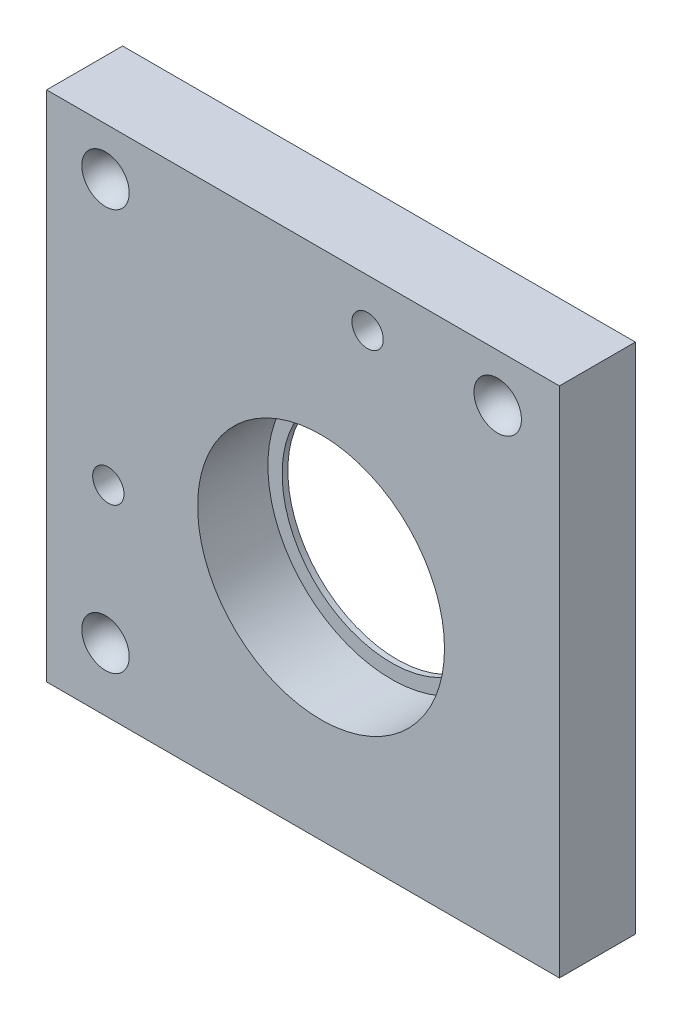
ISO-10303-21;
HEADER;
FILE_DESCRIPTION(('STEP AP214'),'2;1');
FILE_NAME('part.step','',(''),(''),'','','');
FILE_SCHEMA(('AUTOMOTIVE_DESIGN { 1 0 10303 214 1 1 1 1 }'));
ENDSEC;
DATA;
#1=APPLICATION_CONTEXT('core data for automotive mechanical design processes');
#2=APPLICATION_PROTOCOL_DEFINITION('international standard','automotive_design',2000,#1);
#3=PRODUCT_CONTEXT('',#1,'mechanical');
#4=PRODUCT('Part','Part','',(#3));
#5=PRODUCT_RELATED_PRODUCT_CATEGORY('part','',(#4));
#6=PRODUCT_DEFINITION_FORMATION('','',#4);
#7=PRODUCT_DEFINITION_CONTEXT('part definition',#1,'design');
#8=PRODUCT_DEFINITION('design','',#6,#7);
#9=PRODUCT_DEFINITION_SHAPE('','',#8);
#10=(LENGTH_UNIT() NAMED_UNIT(*) SI_UNIT(.MILLI.,.METRE.));
#11=(NAMED_UNIT(*) PLANE_ANGLE_UNIT() SI_UNIT($,.RADIAN.));
#12=(NAMED_UNIT(*) SI_UNIT($,.STERADIAN.) SOLID_ANGLE_UNIT());
#13=UNCERTAINTY_MEASURE_WITH_UNIT(LENGTH_MEASURE(1.E-05),#10,'distance_accuracy_value','');
#14=(GEOMETRIC_REPRESENTATION_CONTEXT(3) GLOBAL_UNCERTAINTY_ASSIGNED_CONTEXT((#13)) GLOBAL_UNIT_ASSIGNED_CONTEXT((#10,
#11,#12)) REPRESENTATION_CONTEXT('',''));
#15=CARTESIAN_POINT('',(0.,0.,0.));
#16=DIRECTION('',(0.,0.,1.));
#17=DIRECTION('',(1.,0.,0.));
#18=AXIS2_PLACEMENT_3D('',#15,#16,#17);
#19=CARTESIAN_POINT('',(-22.7,-17.35,8.5625));
#20=DIRECTION('',(0.,-1.,0.));
#21=DIRECTION('',(1.,0.,0.));
#22=AXIS2_PLACEMENT_3D('',#19,#20,#21);
#23=SPHERICAL_SURFACE('',#22,2.5625);
#24=CARTESIAN_POINT('',(-22.7,-17.35,8.5625));
#25=DIRECTION('',(0.,0.,-1.));
#26=DIRECTION('',(0.,-1.,0.));
#27=AXIS2_PLACEMENT_3D('',#24,#25,#26);
#28=SPHERICAL_SURFACE('',#27,2.5625);
#29=CARTESIAN_POINT('',(-22.7,-17.35,8.));
#30=DIRECTION('',(0.,0.,-1.));
#31=DIRECTION('',(0.,-1.,0.));
#32=AXIS2_PLACEMENT_3D('',#29,#30,#31);
#33=CIRCLE('',#32,2.5);
#34=CARTESIAN_POINT('',(-22.7,-19.85,8.));
#35=VERTEX_POINT('',#34);
#36=EDGE_CURVE('E88',#35,#35,#33,.T.);
#37=ORIENTED_EDGE('',*,*,#36,.F.);
#38=EDGE_LOOP('',(#37));
#39=FACE_BOUND('',#38,.T.);
#40=ADVANCED_FACE('F16',(#39),#28,.F.);
#41=CARTESIAN_POINT('',(-22.7,24.95,8.5625));
#42=DIRECTION('',(0.,-1.,0.));
#43=DIRECTION('',(1.,0.,0.));
#44=AXIS2_PLACEMENT_3D('',#41,#42,#43);
#45=SPHERICAL_SURFACE('',#44,2.5625);
#46=CARTESIAN_POINT('',(-22.7,24.95,8.5625));
#47=DIRECTION('',(0.,0.,-1.));
#48=DIRECTION('',(0.,-1.,0.));
#49=AXIS2_PLACEMENT_3D('',#46,#47,#48);
#50=SPHERICAL_SURFACE('',#49,2.5625);
#51=CARTESIAN_POINT('',(-22.7,24.95,8.));
#52=DIRECTION('',(0.,0.,-1.));
#53=DIRECTION('',(0.,-1.,0.));
#54=AXIS2_PLACEMENT_3D('',#51,#52,#53);
#55=CIRCLE('',#54,2.5);
#56=CARTESIAN_POINT('',(-22.7,22.45,8.));
#57=VERTEX_POINT('',#56);
#58=EDGE_CURVE('E115',#57,#57,#55,.T.);
#59=ORIENTED_EDGE('',*,*,#58,.F.);
#60=EDGE_LOOP('',(#59));
#61=FACE_BOUND('',#60,.T.);
#62=ADVANCED_FACE('F125',(#61),#50,.F.);
#63=CARTESIAN_POINT('',(18.6,24.95,8.5625));
#64=DIRECTION('',(0.,-1.,0.));
#65=DIRECTION('',(1.,0.,0.));
#66=AXIS2_PLACEMENT_3D('',#63,#64,#65);
#67=SPHERICAL_SURFACE('',#66,2.5625);
#68=CARTESIAN_POINT('',(18.6,24.95,8.5625));
#69=DIRECTION('',(0.,0.,-1.));
#70=DIRECTION('',(0.,-1.,0.));
#71=AXIS2_PLACEMENT_3D('',#68,#69,#70);
#72=SPHERICAL_SURFACE('',#71,2.5625);
#73=CARTESIAN_POINT('',(18.6,24.95,8.));
#74=DIRECTION('',(0.,0.,-1.));
#75=DIRECTION('',(0.,-1.,0.));
#76=AXIS2_PLACEMENT_3D('',#73,#74,#75);
#77=CIRCLE('',#76,2.5);
#78=CARTESIAN_POINT('',(18.6,22.45,8.));
#79=VERTEX_POINT('',#78);
#80=EDGE_CURVE('E97',#79,#79,#77,.T.);
#81=ORIENTED_EDGE('',*,*,#80,.F.);
#82=EDGE_LOOP('',(#81));
#83=FACE_BOUND('',#82,.T.);
#84=ADVANCED_FACE('F131',(#83),#72,.F.);
#85=CARTESIAN_POINT('',(4.9,24.95,8.));
#86=DIRECTION('',(0.,0.,1.));
#87=DIRECTION('',(1.,0.,0.));
#88=AXIS2_PLACEMENT_3D('',#85,#86,#87);
#89=CYLINDRICAL_SURFACE('',#88,1.64999999999999);
#90=CARTESIAN_POINT('',(4.9,24.95,0.));
#91=DIRECTION('',(0.,0.,1.));
#92=DIRECTION('',(1.,0.,0.));
#93=AXIS2_PLACEMENT_3D('',#90,#91,#92);
#94=CIRCLE('',#93,1.65);
#95=CARTESIAN_POINT('',(6.55,24.95,0.));
#96=VERTEX_POINT('',#95);
#97=EDGE_CURVE('E98',#96,#96,#94,.T.);
#98=ORIENTED_EDGE('',*,*,#97,.F.);
#99=EDGE_LOOP('',(#98));
#100=FACE_BOUND('',#99,.T.);
#101=CARTESIAN_POINT('',(4.9,24.95,8.));
#102=DIRECTION('',(0.,0.,1.));
#103=DIRECTION('',(1.,0.,0.));
#104=AXIS2_PLACEMENT_3D('',#101,#102,#103);
#105=CIRCLE('',#104,1.64999999999999);
#106=CARTESIAN_POINT('',(6.54999999999999,24.95,8.));
#107=VERTEX_POINT('',#106);
#108=EDGE_CURVE('E11',#107,#107,#105,.T.);
#109=ORIENTED_EDGE('',*,*,#108,.T.);
#110=EDGE_LOOP('',(#109));
#111=FACE_BOUND('',#110,.T.);
#112=ADVANCED_FACE('F137',(#100,#111),#89,.F.);
#113=CARTESIAN_POINT('',(-22.4,-2.8,8.));
#114=DIRECTION('',(0.,0.,1.));
#115=DIRECTION('',(1.,0.,0.));
#116=AXIS2_PLACEMENT_3D('',#113,#114,#115);
#117=CYLINDRICAL_SURFACE('',#116,1.65);
#118=CARTESIAN_POINT('',(-22.4,-2.8,0.));
#119=DIRECTION('',(0.,0.,1.));
#120=DIRECTION('',(1.,0.,0.));
#121=AXIS2_PLACEMENT_3D('',#118,#119,#120);
#122=CIRCLE('',#121,1.65);
#123=CARTESIAN_POINT('',(-20.75,-2.8,0.));
#124=VERTEX_POINT('',#123);
#125=EDGE_CURVE('E84',#124,#124,#122,.T.);
#126=ORIENTED_EDGE('',*,*,#125,.F.);
#127=EDGE_LOOP('',(#126));
#128=FACE_BOUND('',#127,.T.);
#129=CARTESIAN_POINT('',(-22.4,-2.8,8.));
#130=DIRECTION('',(0.,0.,1.));
#131=DIRECTION('',(1.,0.,0.));
#132=AXIS2_PLACEMENT_3D('',#129,#130,#131);
#133=CIRCLE('',#132,1.64999999999999);
#134=CARTESIAN_POINT('',(-20.75,-2.8,8.));
#135=VERTEX_POINT('',#134);
#136=EDGE_CURVE('E26',#135,#135,#133,.T.);
#137=ORIENTED_EDGE('',*,*,#136,.T.);
#138=EDGE_LOOP('',(#137));
#139=FACE_BOUND('',#138,.T.);
#140=ADVANCED_FACE('F162',(#128,#139),#117,.F.);
#141=CARTESIAN_POINT('',(0.,0.,0.6));
#142=DIRECTION('',(0.,0.,1.));
#143=DIRECTION('',(1.,0.,0.));
#144=AXIS2_PLACEMENT_3D('',#141,#142,#143);
#145=CYLINDRICAL_SURFACE('',#144,13.);
#146=CARTESIAN_POINT('',(0.,0.,0.6));
#147=DIRECTION('',(0.,0.,1.));
#148=DIRECTION('',(1.,0.,0.));
#149=AXIS2_PLACEMENT_3D('',#146,#147,#148);
#150=CIRCLE('',#149,13.);
#151=CARTESIAN_POINT('',(13.,0.,0.6));
#152=VERTEX_POINT('',#151);
#153=EDGE_CURVE('E104',#152,#152,#150,.T.);
#154=ORIENTED_EDGE('',*,*,#153,.F.);
#155=EDGE_LOOP('',(#154));
#156=FACE_BOUND('',#155,.T.);
#157=CARTESIAN_POINT('',(0.,0.,8.));
#158=DIRECTION('',(0.,0.,1.));
#159=DIRECTION('',(1.,0.,0.));
#160=AXIS2_PLACEMENT_3D('',#157,#158,#159);
#161=CIRCLE('',#160,13.);
#162=CARTESIAN_POINT('',(13.,0.,8.));
#163=VERTEX_POINT('',#162);
#164=EDGE_CURVE('E101',#163,#163,#161,.T.);
#165=ORIENTED_EDGE('',*,*,#164,.T.);
#166=EDGE_LOOP('',(#165));
#167=FACE_BOUND('',#166,.T.);
#168=ADVANCED_FACE('F165',(#156,#167),#145,.F.);
#169=CARTESIAN_POINT('',(0.,0.,8.));
#170=DIRECTION('',(0.,0.,-1.));
#171=DIRECTION('',(0.,-1.,0.));
#172=AXIS2_PLACEMENT_3D('',#169,#170,#171);
#173=CYLINDRICAL_SURFACE('',#172,11.5);
#174=CARTESIAN_POINT('',(0.,0.,0.6));
#175=DIRECTION('',(0.,0.,1.));
#176=DIRECTION('',(1.,0.,0.));
#177=AXIS2_PLACEMENT_3D('',#174,#175,#176);
#178=CIRCLE('',#177,11.5);
#179=CARTESIAN_POINT('',(11.5,0.,0.6));
#180=VERTEX_POINT('',#179);
#181=EDGE_CURVE('E93',#180,#180,#178,.T.);
#182=ORIENTED_EDGE('',*,*,#181,.T.);
#183=EDGE_LOOP('',(#182));
#184=FACE_BOUND('',#183,.T.);
#185=CARTESIAN_POINT('',(0.,0.,0.));
#186=DIRECTION('',(0.,0.,1.));
#187=DIRECTION('',(1.,0.,0.));
#188=AXIS2_PLACEMENT_3D('',#185,#186,#187);
#189=CIRCLE('',#188,11.5);
#190=CARTESIAN_POINT('',(11.5,0.,0.));
#191=VERTEX_POINT('',#190);
#192=EDGE_CURVE('E94',#191,#191,#189,.T.);
#193=ORIENTED_EDGE('',*,*,#192,.F.);
#194=EDGE_LOOP('',(#193));
#195=FACE_BOUND('',#194,.T.);
#196=ADVANCED_FACE('F18',(#184,#195),#173,.F.);
#197=CARTESIAN_POINT('',(0.,0.,8.));
#198=DIRECTION('',(0.,0.,1.));
#199=DIRECTION('',(1.,0.,0.));
#200=AXIS2_PLACEMENT_3D('',#197,#198,#199);
#201=PLANE('',#200);
#202=DIRECTION('',(0.,1.,0.));
#203=VECTOR('',#202,1.);
#204=CARTESIAN_POINT('',(25.1,30.,8.));
#205=LINE('',#204,#203);
#206=CARTESIAN_POINT('',(25.1,-24.,8.));
#207=VERTEX_POINT('',#206);
#208=CARTESIAN_POINT('',(25.1,30.,8.));
#209=VERTEX_POINT('',#208);
#210=EDGE_CURVE('E91',#207,#209,#205,.T.);
#211=ORIENTED_EDGE('',*,*,#210,.T.);
#212=DIRECTION('',(-1.,0.,0.));
#213=VECTOR('',#212,1.);
#214=CARTESIAN_POINT('',(-28.9,30.,8.));
#215=LINE('',#214,#213);
#216=CARTESIAN_POINT('',(-28.9,30.,8.));
#217=VERTEX_POINT('',#216);
#218=EDGE_CURVE('E35',#209,#217,#215,.T.);
#219=ORIENTED_EDGE('',*,*,#218,.T.);
#220=DIRECTION('',(0.,-1.,0.));
#221=VECTOR('',#220,1.);
#222=CARTESIAN_POINT('',(-28.9,30.,8.));
#223=LINE('',#222,#221);
#224=CARTESIAN_POINT('',(-28.9,-24.,8.));
#225=VERTEX_POINT('',#224);
#226=EDGE_CURVE('E76',#217,#225,#223,.T.);
#227=ORIENTED_EDGE('',*,*,#226,.T.);
#228=DIRECTION('',(1.,0.,0.));
#229=VECTOR('',#228,1.);
#230=CARTESIAN_POINT('',(-28.9,-24.,8.));
#231=LINE('',#230,#229);
#232=EDGE_CURVE('E85',#225,#207,#231,.T.);
#233=ORIENTED_EDGE('',*,*,#232,.T.);
#234=EDGE_LOOP('',(#211,#219,#227,#233));
#235=FACE_BOUND('',#234,.T.);
#236=ORIENTED_EDGE('',*,*,#36,.T.);
#237=EDGE_LOOP('',(#236));
#238=FACE_BOUND('',#237,.T.);
#239=ORIENTED_EDGE('',*,*,#58,.T.);
#240=EDGE_LOOP('',(#239));
#241=FACE_BOUND('',#240,.T.);
#242=ORIENTED_EDGE('',*,*,#80,.T.);
#243=EDGE_LOOP('',(#242));
#244=FACE_BOUND('',#243,.T.);
#245=ORIENTED_EDGE('',*,*,#108,.F.);
#246=EDGE_LOOP('',(#245));
#247=FACE_BOUND('',#246,.T.);
#248=ORIENTED_EDGE('',*,*,#136,.F.);
#249=EDGE_LOOP('',(#248));
#250=FACE_BOUND('',#249,.T.);
#251=ORIENTED_EDGE('',*,*,#164,.F.);
#252=EDGE_LOOP('',(#251));
#253=FACE_BOUND('',#252,.T.);
#254=ADVANCED_FACE('F121',(#235,#238,#241,#244,#247,#250,#253),#201,.T.);
#255=CARTESIAN_POINT('',(0.,0.,0.));
#256=DIRECTION('',(0.,0.,1.));
#257=DIRECTION('',(1.,0.,0.));
#258=AXIS2_PLACEMENT_3D('',#255,#256,#257);
#259=PLANE('',#258);
#260=DIRECTION('',(0.,1.,0.));
#261=VECTOR('',#260,1.);
#262=CARTESIAN_POINT('',(25.1,30.,0.));
#263=LINE('',#262,#261);
#264=CARTESIAN_POINT('',(25.1,-24.,0.));
#265=VERTEX_POINT('',#264);
#266=CARTESIAN_POINT('',(25.1,30.,0.));
#267=VERTEX_POINT('',#266);
#268=EDGE_CURVE('E81',#265,#267,#263,.T.);
#269=ORIENTED_EDGE('',*,*,#268,.F.);
#270=DIRECTION('',(1.,0.,0.));
#271=VECTOR('',#270,1.);
#272=CARTESIAN_POINT('',(-28.9,-24.,0.));
#273=LINE('',#272,#271);
#274=CARTESIAN_POINT('',(-28.9,-24.,0.));
#275=VERTEX_POINT('',#274);
#276=EDGE_CURVE('E55',#275,#265,#273,.T.);
#277=ORIENTED_EDGE('',*,*,#276,.F.);
#278=DIRECTION('',(0.,-1.,0.));
#279=VECTOR('',#278,1.);
#280=CARTESIAN_POINT('',(-28.9,30.,0.));
#281=LINE('',#280,#279);
#282=CARTESIAN_POINT('',(-28.9,30.,0.));
#283=VERTEX_POINT('',#282);
#284=EDGE_CURVE('E57',#283,#275,#281,.T.);
#285=ORIENTED_EDGE('',*,*,#284,.F.);
#286=DIRECTION('',(-1.,0.,0.));
#287=VECTOR('',#286,1.);
#288=CARTESIAN_POINT('',(-28.9,30.,0.));
#289=LINE('',#288,#287);
#290=EDGE_CURVE('E61',#267,#283,#289,.T.);
#291=ORIENTED_EDGE('',*,*,#290,.F.);
#292=EDGE_LOOP('',(#269,#277,#285,#291));
#293=FACE_BOUND('',#292,.T.);
#294=ORIENTED_EDGE('',*,*,#192,.T.);
#295=EDGE_LOOP('',(#294));
#296=FACE_BOUND('',#295,.T.);
#297=ORIENTED_EDGE('',*,*,#97,.T.);
#298=EDGE_LOOP('',(#297));
#299=FACE_BOUND('',#298,.T.);
#300=ORIENTED_EDGE('',*,*,#125,.T.);
#301=EDGE_LOOP('',(#300));
#302=FACE_BOUND('',#301,.T.);
#303=ADVANCED_FACE('F59',(#293,#296,#299,#302),#259,.F.);
#304=CARTESIAN_POINT('',(25.1,30.,8.));
#305=DIRECTION('',(-1.,0.,0.));
#306=DIRECTION('',(0.,0.,1.));
#307=AXIS2_PLACEMENT_3D('',#304,#305,#306);
#308=PLANE('',#307);
#309=ORIENTED_EDGE('',*,*,#268,.T.);
#310=DIRECTION('',(0.,0.,-1.));
#311=VECTOR('',#310,1.);
#312=CARTESIAN_POINT('',(25.1,30.,8.));
#313=LINE('',#312,#311);
#314=EDGE_CURVE('E67',#209,#267,#313,.T.);
#315=ORIENTED_EDGE('',*,*,#314,.F.);
#316=ORIENTED_EDGE('',*,*,#210,.F.);
#317=DIRECTION('',(0.,0.,-1.));
#318=VECTOR('',#317,1.);
#319=CARTESIAN_POINT('',(25.1,-24.,8.));
#320=LINE('',#319,#318);
#321=EDGE_CURVE('E72',#207,#265,#320,.T.);
#322=ORIENTED_EDGE('',*,*,#321,.T.);
#323=EDGE_LOOP('',(#309,#315,#316,#322));
#324=FACE_BOUND('',#323,.T.);
#325=ADVANCED_FACE('F144',(#324),#308,.F.);
#326=CARTESIAN_POINT('',(-28.9,30.,8.));
#327=DIRECTION('',(0.,-1.,0.));
#328=DIRECTION('',(0.,0.,-1.));
#329=AXIS2_PLACEMENT_3D('',#326,#327,#328);
#330=PLANE('',#329);
#331=ORIENTED_EDGE('',*,*,#290,.T.);
#332=DIRECTION('',(0.,0.,-1.));
#333=VECTOR('',#332,1.);
#334=CARTESIAN_POINT('',(-28.9,30.,8.));
#335=LINE('',#334,#333);
#336=EDGE_CURVE('E68',#217,#283,#335,.T.);
#337=ORIENTED_EDGE('',*,*,#336,.F.);
#338=ORIENTED_EDGE('',*,*,#218,.F.);
#339=ORIENTED_EDGE('',*,*,#314,.T.);
#340=EDGE_LOOP('',(#331,#337,#338,#339));
#341=FACE_BOUND('',#340,.T.);
#342=ADVANCED_FACE('F70',(#341),#330,.F.);
#343=CARTESIAN_POINT('',(-28.9,30.,8.));
#344=DIRECTION('',(1.,0.,0.));
#345=DIRECTION('',(0.,1.,0.));
#346=AXIS2_PLACEMENT_3D('',#343,#344,#345);
#347=PLANE('',#346);
#348=ORIENTED_EDGE('',*,*,#284,.T.);
#349=DIRECTION('',(0.,0.,-1.));
#350=VECTOR('',#349,1.);
#351=CARTESIAN_POINT('',(-28.9,-24.,8.));
#352=LINE('',#351,#350);
#353=EDGE_CURVE('E20',#225,#275,#352,.T.);
#354=ORIENTED_EDGE('',*,*,#353,.F.);
#355=ORIENTED_EDGE('',*,*,#226,.F.);
#356=ORIENTED_EDGE('',*,*,#336,.T.);
#357=EDGE_LOOP('',(#348,#354,#355,#356));
#358=FACE_BOUND('',#357,.T.);
#359=ADVANCED_FACE('F74',(#358),#347,.F.);
#360=CARTESIAN_POINT('',(-28.9,-24.,8.));
#361=DIRECTION('',(0.,1.,0.));
#362=DIRECTION('',(0.,0.,1.));
#363=AXIS2_PLACEMENT_3D('',#360,#361,#362);
#364=PLANE('',#363);
#365=ORIENTED_EDGE('',*,*,#276,.T.);
#366=ORIENTED_EDGE('',*,*,#321,.F.);
#367=ORIENTED_EDGE('',*,*,#232,.F.);
#368=ORIENTED_EDGE('',*,*,#353,.T.);
#369=EDGE_LOOP('',(#365,#366,#367,#368));
#370=FACE_BOUND('',#369,.T.);
#371=ADVANCED_FACE('F152',(#370),#364,.F.);
#372=CARTESIAN_POINT('',(0.,0.,0.6));
#373=DIRECTION('',(0.,0.,1.));
#374=DIRECTION('',(1.,0.,0.));
#375=AXIS2_PLACEMENT_3D('',#372,#373,#374);
#376=PLANE('',#375);
#377=ORIENTED_EDGE('',*,*,#153,.T.);
#378=EDGE_LOOP('',(#377));
#379=FACE_BOUND('',#378,.T.);
#380=ORIENTED_EDGE('',*,*,#181,.F.);
#381=EDGE_LOOP('',(#380));
#382=FACE_BOUND('',#381,.T.);
#383=ADVANCED_FACE('F155',(#379,#382),#376,.T.);
#384=CLOSED_SHELL('',(#40,#62,#84,#112,#140,#168,#196,#254,#303,#325,#342,#359,#371,#383));
#385=MANIFOLD_SOLID_BREP('B1',#384);
#386=ADVANCED_BREP_SHAPE_REPRESENTATION('',(#18,#385),#14);
#387=SHAPE_DEFINITION_REPRESENTATION(#9,#386);
ENDSEC;
END-ISO-10303-21;
